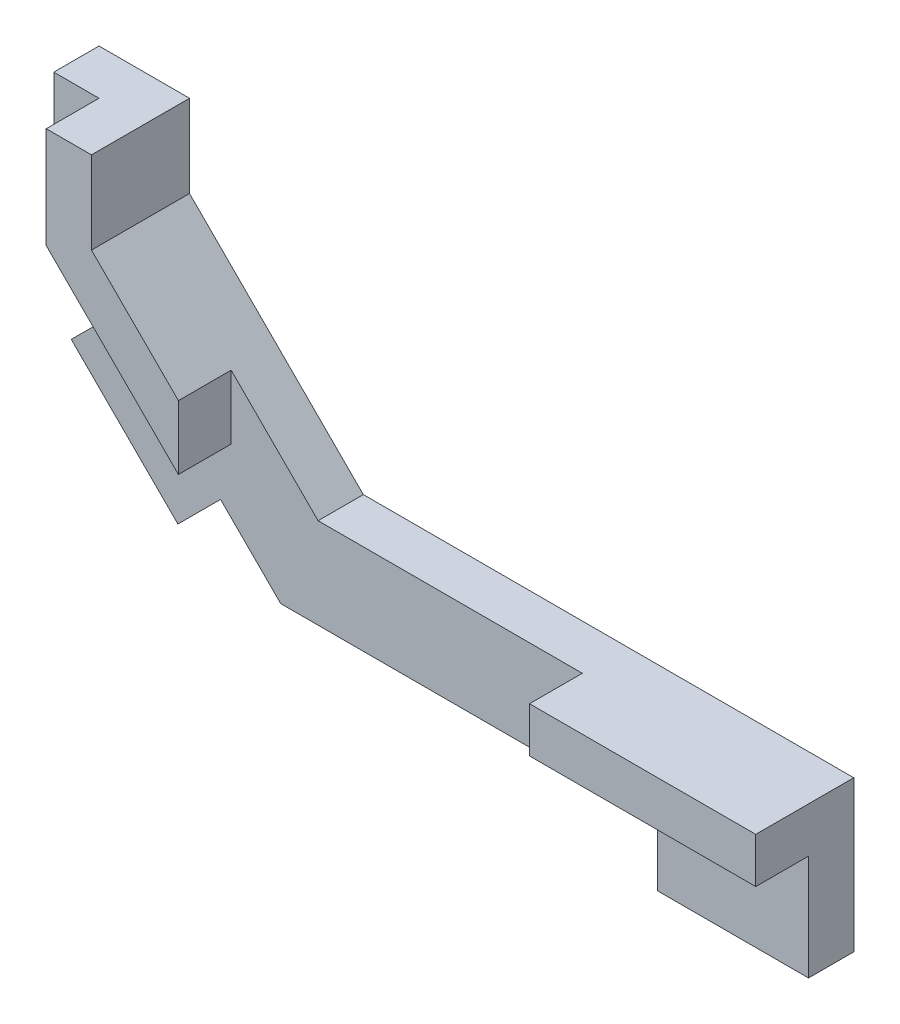
ISO-10303-21;
HEADER;
FILE_DESCRIPTION(('STEP AP214'),'2;1');
FILE_NAME('part.step','',(''),(''),'','','');
FILE_SCHEMA(('AUTOMOTIVE_DESIGN { 1 0 10303 214 1 1 1 1 }'));
ENDSEC;
DATA;
#1=APPLICATION_CONTEXT('core data for automotive mechanical design processes');
#2=APPLICATION_PROTOCOL_DEFINITION('international standard','automotive_design',2000,#1);
#3=PRODUCT_CONTEXT('',#1,'mechanical');
#4=PRODUCT('Part','Part','',(#3));
#5=PRODUCT_RELATED_PRODUCT_CATEGORY('part','',(#4));
#6=PRODUCT_DEFINITION_FORMATION('','',#4);
#7=PRODUCT_DEFINITION_CONTEXT('part definition',#1,'design');
#8=PRODUCT_DEFINITION('design','',#6,#7);
#9=PRODUCT_DEFINITION_SHAPE('','',#8);
#10=(LENGTH_UNIT() NAMED_UNIT(*) SI_UNIT(.MILLI.,.METRE.));
#11=(NAMED_UNIT(*) PLANE_ANGLE_UNIT() SI_UNIT($,.RADIAN.));
#12=(NAMED_UNIT(*) SI_UNIT($,.STERADIAN.) SOLID_ANGLE_UNIT());
#13=UNCERTAINTY_MEASURE_WITH_UNIT(LENGTH_MEASURE(1.E-05),#10,'distance_accuracy_value','');
#14=(GEOMETRIC_REPRESENTATION_CONTEXT(3) GLOBAL_UNCERTAINTY_ASSIGNED_CONTEXT((#13)) GLOBAL_UNIT_ASSIGNED_CONTEXT((#10,
#11,#12)) REPRESENTATION_CONTEXT('',''));
#15=CARTESIAN_POINT('',(0.,0.,0.));
#16=DIRECTION('',(0.,0.,1.));
#17=DIRECTION('',(1.,0.,0.));
#18=AXIS2_PLACEMENT_3D('',#15,#16,#17);
#19=CARTESIAN_POINT('',(-17.5,0.,-30.4149886020059));
#20=DIRECTION('',(-0.707106781186544,-0.707106781186551,0.));
#21=DIRECTION('',(0.707106781186551,-0.707106781186544,0.));
#22=AXIS2_PLACEMENT_3D('',#19,#20,#21);
#23=PLANE('',#22);
#24=DIRECTION('',(0.707106781186551,-0.707106781186544,0.));
#25=VECTOR('',#24,1.);
#26=CARTESIAN_POINT('',(-17.5,0.,1.5));
#27=LINE('',#26,#25);
#28=CARTESIAN_POINT('',(-21.4880822458922,3.9880822458921,1.5));
#29=VERTEX_POINT('',#28);
#30=CARTESIAN_POINT('',(-17.5,0.,1.5));
#31=VERTEX_POINT('',#30);
#32=EDGE_CURVE('E474',#29,#31,#27,.T.);
#33=ORIENTED_EDGE('',*,*,#32,.F.);
#34=DIRECTION('',(0.,0.,1.));
#35=VECTOR('',#34,1.);
#36=CARTESIAN_POINT('',(-21.4880822458922,3.9880822458921,1.5));
#37=LINE('',#36,#35);
#38=CARTESIAN_POINT('',(-21.4880822458922,3.9880822458921,-1.5));
#39=VERTEX_POINT('',#38);
#40=EDGE_CURVE('E536',#39,#29,#37,.T.);
#41=ORIENTED_EDGE('',*,*,#40,.F.);
#42=DIRECTION('',(-0.707106781186551,0.707106781186544,0.));
#43=VECTOR('',#42,1.);
#44=CARTESIAN_POINT('',(-17.5,0.,-1.5));
#45=LINE('',#44,#43);
#46=CARTESIAN_POINT('',(-17.5,0.,-1.5));
#47=VERTEX_POINT('',#46);
#48=EDGE_CURVE('E335',#47,#39,#45,.T.);
#49=ORIENTED_EDGE('',*,*,#48,.F.);
#50=DIRECTION('',(0.,0.,1.));
#51=VECTOR('',#50,1.);
#52=CARTESIAN_POINT('',(-17.5,0.,1.5));
#53=LINE('',#52,#51);
#54=EDGE_CURVE('E464',#47,#31,#53,.T.);
#55=ORIENTED_EDGE('',*,*,#54,.T.);
#56=EDGE_LOOP('',(#33,#41,#49,#55));
#57=FACE_BOUND('',#56,.T.);
#58=ADVANCED_FACE('F165',(#57),#23,.T.);
#59=CARTESIAN_POINT('',(-28.5591500577577,11.0591500577575,-1.5));
#60=VERTEX_POINT('',#59);
#61=CARTESIAN_POINT('',(-32.5472323036498,15.0472323036496,-1.49999999999999));
#62=VERTEX_POINT('',#61);
#63=EDGE_CURVE('E461',#60,#62,#45,.T.);
#64=ORIENTED_EDGE('',*,*,#63,.F.);
#65=DIRECTION('',(0.,0.,-1.));
#66=VECTOR('',#65,1.);
#67=CARTESIAN_POINT('',(-28.5591500577577,11.0591500577575,1.5));
#68=LINE('',#67,#66);
#69=CARTESIAN_POINT('',(-28.5591500577577,11.0591500577575,1.5));
#70=VERTEX_POINT('',#69);
#71=EDGE_CURVE('E330',#70,#60,#68,.T.);
#72=ORIENTED_EDGE('',*,*,#71,.F.);
#73=CARTESIAN_POINT('',(-32.5472323036498,15.0472323036496,1.5));
#74=VERTEX_POINT('',#73);
#75=EDGE_CURVE('E475',#74,#70,#27,.T.);
#76=ORIENTED_EDGE('',*,*,#75,.F.);
#77=DIRECTION('',(0.,0.,1.));
#78=VECTOR('',#77,1.);
#79=CARTESIAN_POINT('',(-32.5472323036498,15.0472323036496,-30.4149886020059));
#80=LINE('',#79,#78);
#81=EDGE_CURVE('E452',#62,#74,#80,.T.);
#82=ORIENTED_EDGE('',*,*,#81,.F.);
#83=EDGE_LOOP('',(#64,#72,#76,#82));
#84=FACE_BOUND('',#83,.T.);
#85=ADVANCED_FACE('F555',(#84),#23,.T.);
#86=CARTESIAN_POINT('',(0.,0.,0.));
#87=DIRECTION('',(0.,1.,0.));
#88=DIRECTION('',(0.,0.,1.));
#89=AXIS2_PLACEMENT_3D('',#86,#87,#88);
#90=PLANE('',#89);
#91=DIRECTION('',(0.,0.,-1.));
#92=VECTOR('',#91,1.);
#93=CARTESIAN_POINT('',(7.49999999999999,0.,-1.5));
#94=LINE('',#93,#92);
#95=CARTESIAN_POINT('',(7.49999999999999,0.,1.5));
#96=VERTEX_POINT('',#95);
#97=CARTESIAN_POINT('',(7.49999999999999,0.,-1.5));
#98=VERTEX_POINT('',#97);
#99=EDGE_CURVE('E189',#96,#98,#94,.T.);
#100=ORIENTED_EDGE('',*,*,#99,.F.);
#101=DIRECTION('',(1.,0.,0.));
#102=VECTOR('',#101,1.);
#103=CARTESIAN_POINT('',(17.5,0.,1.5));
#104=LINE('',#103,#102);
#105=EDGE_CURVE('E508',#31,#96,#104,.T.);
#106=ORIENTED_EDGE('',*,*,#105,.F.);
#107=ORIENTED_EDGE('',*,*,#54,.F.);
#108=DIRECTION('',(-1.,0.,0.));
#109=VECTOR('',#108,1.);
#110=CARTESIAN_POINT('',(17.5,0.,-1.5));
#111=LINE('',#110,#109);
#112=EDGE_CURVE('E499',#98,#47,#111,.T.);
#113=ORIENTED_EDGE('',*,*,#112,.F.);
#114=EDGE_LOOP('',(#100,#106,#107,#113));
#115=FACE_BOUND('',#114,.T.);
#116=ADVANCED_FACE('F533',(#115),#90,.F.);
#117=CARTESIAN_POINT('',(17.5,6.,1.5));
#118=DIRECTION('',(0.,0.,-1.));
#119=DIRECTION('',(-1.,0.,0.));
#120=AXIS2_PLACEMENT_3D('',#117,#118,#119);
#121=PLANE('',#120);
#122=DIRECTION('',(1.,0.,0.));
#123=VECTOR('',#122,1.);
#124=CARTESIAN_POINT('',(17.5,3.,1.5));
#125=LINE('',#124,#123);
#126=CARTESIAN_POINT('',(2.5,3.,1.5));
#127=VERTEX_POINT('',#126);
#128=CARTESIAN_POINT('',(17.5,3.,1.5));
#129=VERTEX_POINT('',#128);
#130=EDGE_CURVE('E395',#127,#129,#125,.T.);
#131=ORIENTED_EDGE('',*,*,#130,.F.);
#132=DIRECTION('',(0.,1.,0.));
#133=VECTOR('',#132,1.);
#134=CARTESIAN_POINT('',(2.5,6.,1.5));
#135=LINE('',#134,#133);
#136=CARTESIAN_POINT('',(2.5,6.,1.5));
#137=VERTEX_POINT('',#136);
#138=EDGE_CURVE('E391',#127,#137,#135,.T.);
#139=ORIENTED_EDGE('',*,*,#138,.T.);
#140=DIRECTION('',(1.,0.,0.));
#141=VECTOR('',#140,1.);
#142=CARTESIAN_POINT('',(17.5,6.,1.5));
#143=LINE('',#142,#141);
#144=CARTESIAN_POINT('',(-15.0200000000001,6.,1.5));
#145=VERTEX_POINT('',#144);
#146=EDGE_CURVE('E494',#145,#137,#143,.T.);
#147=ORIENTED_EDGE('',*,*,#146,.F.);
#148=DIRECTION('',(-0.707106781186551,0.707106781186544,0.));
#149=VECTOR('',#148,1.);
#150=CARTESIAN_POINT('',(-26.5472323036498,17.5272323036496,1.5));
#151=LINE('',#150,#149);
#152=CARTESIAN_POINT('',(-20.783616151825,11.7636161518248,1.5));
#153=VERTEX_POINT('',#152);
#154=EDGE_CURVE('E446',#145,#153,#151,.T.);
#155=ORIENTED_EDGE('',*,*,#154,.T.);
#156=DIRECTION('',(0.,1.,0.));
#157=VECTOR('',#156,1.);
#158=CARTESIAN_POINT('',(-20.7836161518249,6.,1.5));
#159=LINE('',#158,#157);
#160=CARTESIAN_POINT('',(-20.783616151825,7.52097546470556,1.5));
#161=VERTEX_POINT('',#160);
#162=EDGE_CURVE('E426',#161,#153,#159,.T.);
#163=ORIENTED_EDGE('',*,*,#162,.F.);
#164=DIRECTION('',(0.70710678118655,-0.707106781186545,0.));
#165=VECTOR('',#164,1.);
#166=CARTESIAN_POINT('',(-0.881320343559554,-12.3813203435597,1.5));
#167=LINE('',#166,#165);
#168=CARTESIAN_POINT('',(-29.5472323036498,16.2845916165304,1.5));
#169=VERTEX_POINT('',#168);
#170=EDGE_CURVE('E442',#169,#161,#167,.T.);
#171=ORIENTED_EDGE('',*,*,#170,.F.);
#172=DIRECTION('',(0.,-1.,0.));
#173=VECTOR('',#172,1.);
#174=CARTESIAN_POINT('',(-29.5472323036498,6.,1.5));
#175=LINE('',#174,#173);
#176=CARTESIAN_POINT('',(-29.5472323036498,22.9972323036496,1.5));
#177=VERTEX_POINT('',#176);
#178=EDGE_CURVE('E438',#177,#169,#175,.T.);
#179=ORIENTED_EDGE('',*,*,#178,.F.);
#180=DIRECTION('',(-1.,0.,0.));
#181=VECTOR('',#180,1.);
#182=CARTESIAN_POINT('',(-32.5472323036498,22.9972323036496,1.5));
#183=LINE('',#182,#181);
#184=CARTESIAN_POINT('',(-32.5472323036498,22.9972323036496,1.5));
#185=VERTEX_POINT('',#184);
#186=EDGE_CURVE('E467',#177,#185,#183,.T.);
#187=ORIENTED_EDGE('',*,*,#186,.T.);
#188=DIRECTION('',(0.,-1.,0.));
#189=VECTOR('',#188,1.);
#190=CARTESIAN_POINT('',(-32.5472323036498,15.0472323036496,1.5));
#191=LINE('',#190,#189);
#192=EDGE_CURVE('E470',#185,#74,#191,.T.);
#193=ORIENTED_EDGE('',*,*,#192,.T.);
#194=ORIENTED_EDGE('',*,*,#75,.T.);
#195=DIRECTION('',(0.707106781186544,0.707106781186552,0.));
#196=VECTOR('',#195,1.);
#197=CARTESIAN_POINT('',(-31.3875771825039,8.23072293301134,1.5));
#198=LINE('',#197,#196);
#199=CARTESIAN_POINT('',(-31.3875771825039,8.23072293301134,1.5));
#200=VERTEX_POINT('',#199);
#201=EDGE_CURVE('E181',#200,#70,#198,.T.);
#202=ORIENTED_EDGE('',*,*,#201,.F.);
#203=DIRECTION('',(-0.707106781186551,0.707106781186544,0.));
#204=VECTOR('',#203,1.);
#205=CARTESIAN_POINT('',(-24.3165093706383,1.1596551211459,1.5));
#206=LINE('',#205,#204);
#207=CARTESIAN_POINT('',(-24.3165093706383,1.1596551211459,1.5));
#208=VERTEX_POINT('',#207);
#209=EDGE_CURVE('E320',#208,#200,#206,.T.);
#210=ORIENTED_EDGE('',*,*,#209,.F.);
#211=DIRECTION('',(0.707106781186544,0.707106781186552,0.));
#212=VECTOR('',#211,1.);
#213=CARTESIAN_POINT('',(-24.3165093706383,1.1596551211459,1.5));
#214=LINE('',#213,#212);
#215=EDGE_CURVE('E316',#208,#29,#214,.T.);
#216=ORIENTED_EDGE('',*,*,#215,.T.);
#217=ORIENTED_EDGE('',*,*,#32,.T.);
#218=ORIENTED_EDGE('',*,*,#105,.T.);
#219=DIRECTION('',(0.,1.,0.));
#220=VECTOR('',#219,1.);
#221=CARTESIAN_POINT('',(7.49999999999999,-4.,1.5));
#222=LINE('',#221,#220);
#223=CARTESIAN_POINT('',(7.49999999999999,-4.,1.5));
#224=VERTEX_POINT('',#223);
#225=EDGE_CURVE('E362',#224,#96,#222,.T.);
#226=ORIENTED_EDGE('',*,*,#225,.F.);
#227=DIRECTION('',(-1.,0.,0.));
#228=VECTOR('',#227,1.);
#229=CARTESIAN_POINT('',(7.49999999999999,-4.,1.5));
#230=LINE('',#229,#228);
#231=CARTESIAN_POINT('',(17.5,-4.,1.5));
#232=VERTEX_POINT('',#231);
#233=EDGE_CURVE('E348',#232,#224,#230,.T.);
#234=ORIENTED_EDGE('',*,*,#233,.F.);
#235=DIRECTION('',(0.,-1.,0.));
#236=VECTOR('',#235,1.);
#237=CARTESIAN_POINT('',(17.5,6.,1.5));
#238=LINE('',#237,#236);
#239=EDGE_CURVE('E12',#129,#232,#238,.T.);
#240=ORIENTED_EDGE('',*,*,#239,.F.);
#241=EDGE_LOOP('',(#131,#139,#147,#155,#163,#171,#179,#187,#193,#194,#202,#210,#216,#217,#218,
#226,#234,#240));
#242=FACE_BOUND('',#241,.T.);
#243=ADVANCED_FACE('F167',(#242),#121,.F.);
#244=CARTESIAN_POINT('',(17.5,6.,1.5));
#245=DIRECTION('',(-1.,0.,0.));
#246=DIRECTION('',(0.,0.,1.));
#247=AXIS2_PLACEMENT_3D('',#244,#245,#246);
#248=PLANE('',#247);
#249=DIRECTION('',(0.,0.,-1.));
#250=VECTOR('',#249,1.);
#251=CARTESIAN_POINT('',(17.5,6.,1.5));
#252=LINE('',#251,#250);
#253=CARTESIAN_POINT('',(17.5,6.,5.));
#254=VERTEX_POINT('',#253);
#255=CARTESIAN_POINT('',(17.5,6.,-1.5));
#256=VERTEX_POINT('',#255);
#257=EDGE_CURVE('E498',#254,#256,#252,.T.);
#258=ORIENTED_EDGE('',*,*,#257,.F.);
#259=DIRECTION('',(0.,1.,0.));
#260=VECTOR('',#259,1.);
#261=CARTESIAN_POINT('',(17.5,0.,5.));
#262=LINE('',#261,#260);
#263=CARTESIAN_POINT('',(17.5,3.,5.));
#264=VERTEX_POINT('',#263);
#265=EDGE_CURVE('E370',#264,#254,#262,.T.);
#266=ORIENTED_EDGE('',*,*,#265,.F.);
#267=DIRECTION('',(0.,0.,1.));
#268=VECTOR('',#267,1.);
#269=CARTESIAN_POINT('',(17.5,3.,-19.2852605772727));
#270=LINE('',#269,#268);
#271=EDGE_CURVE('E366',#129,#264,#270,.T.);
#272=ORIENTED_EDGE('',*,*,#271,.F.);
#273=ORIENTED_EDGE('',*,*,#239,.T.);
#274=DIRECTION('',(0.,0.,1.));
#275=VECTOR('',#274,1.);
#276=CARTESIAN_POINT('',(17.5,-4.,-1.5));
#277=LINE('',#276,#275);
#278=CARTESIAN_POINT('',(17.5,-4.,-1.5));
#279=VERTEX_POINT('',#278);
#280=EDGE_CURVE('E340',#279,#232,#277,.T.);
#281=ORIENTED_EDGE('',*,*,#280,.F.);
#282=DIRECTION('',(0.,-1.,0.));
#283=VECTOR('',#282,1.);
#284=CARTESIAN_POINT('',(17.5,6.,-1.5));
#285=LINE('',#284,#283);
#286=EDGE_CURVE('E174',#256,#279,#285,.T.);
#287=ORIENTED_EDGE('',*,*,#286,.F.);
#288=EDGE_LOOP('',(#258,#266,#272,#273,#281,#287));
#289=FACE_BOUND('',#288,.T.);
#290=ADVANCED_FACE('F522',(#289),#248,.F.);
#291=CARTESIAN_POINT('',(17.5,6.,-1.5));
#292=DIRECTION('',(0.,0.,1.));
#293=DIRECTION('',(1.,0.,0.));
#294=AXIS2_PLACEMENT_3D('',#291,#292,#293);
#295=PLANE('',#294);
#296=ORIENTED_EDGE('',*,*,#286,.T.);
#297=DIRECTION('',(1.,0.,0.));
#298=VECTOR('',#297,1.);
#299=CARTESIAN_POINT('',(7.49999999999999,-4.,-1.5));
#300=LINE('',#299,#298);
#301=CARTESIAN_POINT('',(7.49999999999999,-4.,-1.5));
#302=VERTEX_POINT('',#301);
#303=EDGE_CURVE('E354',#302,#279,#300,.T.);
#304=ORIENTED_EDGE('',*,*,#303,.F.);
#305=DIRECTION('',(0.,1.,0.));
#306=VECTOR('',#305,1.);
#307=CARTESIAN_POINT('',(7.49999999999999,-4.,-1.5));
#308=LINE('',#307,#306);
#309=EDGE_CURVE('E357',#302,#98,#308,.T.);
#310=ORIENTED_EDGE('',*,*,#309,.T.);
#311=ORIENTED_EDGE('',*,*,#112,.T.);
#312=ORIENTED_EDGE('',*,*,#48,.T.);
#313=DIRECTION('',(0.707106781186544,0.707106781186552,0.));
#314=VECTOR('',#313,1.);
#315=CARTESIAN_POINT('',(-24.3165093706383,1.1596551211459,-1.5));
#316=LINE('',#315,#314);
#317=CARTESIAN_POINT('',(-24.3165093706383,1.1596551211459,-1.5));
#318=VERTEX_POINT('',#317);
#319=EDGE_CURVE('E313',#318,#39,#316,.T.);
#320=ORIENTED_EDGE('',*,*,#319,.F.);
#321=DIRECTION('',(0.707106781186551,-0.707106781186544,0.));
#322=VECTOR('',#321,1.);
#323=CARTESIAN_POINT('',(-24.3165093706383,1.1596551211459,-1.5));
#324=LINE('',#323,#322);
#325=CARTESIAN_POINT('',(-31.3875771825039,8.23072293301134,-1.5));
#326=VERTEX_POINT('',#325);
#327=EDGE_CURVE('E321',#326,#318,#324,.T.);
#328=ORIENTED_EDGE('',*,*,#327,.F.);
#329=DIRECTION('',(0.707106781186544,0.707106781186552,0.));
#330=VECTOR('',#329,1.);
#331=CARTESIAN_POINT('',(-31.3875771825039,8.23072293301134,-1.5));
#332=LINE('',#331,#330);
#333=EDGE_CURVE('E544',#326,#60,#332,.T.);
#334=ORIENTED_EDGE('',*,*,#333,.T.);
#335=ORIENTED_EDGE('',*,*,#63,.T.);
#336=DIRECTION('',(0.,1.,0.));
#337=VECTOR('',#336,1.);
#338=CARTESIAN_POINT('',(-32.5472323036498,15.0472323036496,-1.49999999999999));
#339=LINE('',#338,#337);
#340=CARTESIAN_POINT('',(-32.5472323036498,22.9972323036496,-1.49999999999999));
#341=VERTEX_POINT('',#340);
#342=EDGE_CURVE('E458',#62,#341,#339,.T.);
#343=ORIENTED_EDGE('',*,*,#342,.T.);
#344=DIRECTION('',(1.,0.,0.));
#345=VECTOR('',#344,1.);
#346=CARTESIAN_POINT('',(-32.5472323036498,22.9972323036496,-1.49999999999999));
#347=LINE('',#346,#345);
#348=CARTESIAN_POINT('',(-26.5472323036498,22.9972323036496,-1.5));
#349=VERTEX_POINT('',#348);
#350=EDGE_CURVE('E455',#341,#349,#347,.T.);
#351=ORIENTED_EDGE('',*,*,#350,.T.);
#352=DIRECTION('',(0.,-1.,0.));
#353=VECTOR('',#352,1.);
#354=CARTESIAN_POINT('',(-26.5472323036498,22.9972323036496,-1.5));
#355=LINE('',#354,#353);
#356=CARTESIAN_POINT('',(-26.5472323036498,17.5272323036496,-1.5));
#357=VERTEX_POINT('',#356);
#358=EDGE_CURVE('E451',#349,#357,#355,.T.);
#359=ORIENTED_EDGE('',*,*,#358,.T.);
#360=DIRECTION('',(0.707106781186551,-0.707106781186544,0.));
#361=VECTOR('',#360,1.);
#362=CARTESIAN_POINT('',(-26.5472323036498,17.5272323036496,-1.5));
#363=LINE('',#362,#361);
#364=CARTESIAN_POINT('',(-15.0200000000001,6.,-1.5));
#365=VERTEX_POINT('',#364);
#366=EDGE_CURVE('E447',#357,#365,#363,.T.);
#367=ORIENTED_EDGE('',*,*,#366,.T.);
#368=DIRECTION('',(-1.,0.,0.));
#369=VECTOR('',#368,1.);
#370=CARTESIAN_POINT('',(17.5,6.,-1.5));
#371=LINE('',#370,#369);
#372=EDGE_CURVE('E502',#256,#365,#371,.T.);
#373=ORIENTED_EDGE('',*,*,#372,.F.);
#374=EDGE_LOOP('',(#296,#304,#310,#311,#312,#320,#328,#334,#335,#343,#351,#359,#367,#373));
#375=FACE_BOUND('',#374,.T.);
#376=ADVANCED_FACE('F333',(#375),#295,.F.);
#377=CARTESIAN_POINT('',(0.,6.,0.));
#378=DIRECTION('',(0.,1.,0.));
#379=DIRECTION('',(0.,0.,1.));
#380=AXIS2_PLACEMENT_3D('',#377,#378,#379);
#381=PLANE('',#380);
#382=ORIENTED_EDGE('',*,*,#146,.T.);
#383=DIRECTION('',(0.,0.,1.));
#384=VECTOR('',#383,1.);
#385=CARTESIAN_POINT('',(2.5,6.,-19.2852605772727));
#386=LINE('',#385,#384);
#387=CARTESIAN_POINT('',(2.5,6.,5.));
#388=VERTEX_POINT('',#387);
#389=EDGE_CURVE('E367',#137,#388,#386,.T.);
#390=ORIENTED_EDGE('',*,*,#389,.T.);
#391=DIRECTION('',(-1.,0.,0.));
#392=VECTOR('',#391,1.);
#393=CARTESIAN_POINT('',(0.,6.,5.));
#394=LINE('',#393,#392);
#395=EDGE_CURVE('E387',#254,#388,#394,.T.);
#396=ORIENTED_EDGE('',*,*,#395,.F.);
#397=ORIENTED_EDGE('',*,*,#257,.T.);
#398=ORIENTED_EDGE('',*,*,#372,.T.);
#399=DIRECTION('',(0.,0.,1.));
#400=VECTOR('',#399,1.);
#401=CARTESIAN_POINT('',(-15.0200000000001,6.,-30.4149886020059));
#402=LINE('',#401,#400);
#403=EDGE_CURVE('E479',#365,#145,#402,.T.);
#404=ORIENTED_EDGE('',*,*,#403,.T.);
#405=EDGE_LOOP('',(#382,#390,#396,#397,#398,#404));
#406=FACE_BOUND('',#405,.T.);
#407=ADVANCED_FACE('F591',(#406),#381,.T.);
#408=CARTESIAN_POINT('',(-32.5472323036498,15.0472323036496,-30.4149886020059));
#409=DIRECTION('',(-1.,0.,0.));
#410=DIRECTION('',(0.,-1.,0.));
#411=AXIS2_PLACEMENT_3D('',#408,#409,#410);
#412=PLANE('',#411);
#413=ORIENTED_EDGE('',*,*,#342,.F.);
#414=ORIENTED_EDGE('',*,*,#81,.T.);
#415=ORIENTED_EDGE('',*,*,#192,.F.);
#416=DIRECTION('',(0.,0.,1.));
#417=VECTOR('',#416,1.);
#418=CARTESIAN_POINT('',(-32.5472323036498,22.9972323036496,-30.4149886020059));
#419=LINE('',#418,#417);
#420=EDGE_CURVE('E482',#341,#185,#419,.T.);
#421=ORIENTED_EDGE('',*,*,#420,.F.);
#422=EDGE_LOOP('',(#413,#414,#415,#421));
#423=FACE_BOUND('',#422,.T.);
#424=ADVANCED_FACE('F560',(#423),#412,.T.);
#425=CARTESIAN_POINT('',(-32.5472323036498,22.9972323036496,-30.4149886020059));
#426=DIRECTION('',(0.,1.,0.));
#427=DIRECTION('',(-1.,0.,0.));
#428=AXIS2_PLACEMENT_3D('',#425,#426,#427);
#429=PLANE('',#428);
#430=DIRECTION('',(0.,0.,1.));
#431=VECTOR('',#430,1.);
#432=CARTESIAN_POINT('',(-26.5472323036498,22.9972323036496,-30.4149886020059));
#433=LINE('',#432,#431);
#434=CARTESIAN_POINT('',(-26.5472323036498,22.9972323036496,5.));
#435=VERTEX_POINT('',#434);
#436=EDGE_CURVE('E486',#349,#435,#433,.T.);
#437=ORIENTED_EDGE('',*,*,#436,.F.);
#438=ORIENTED_EDGE('',*,*,#350,.F.);
#439=ORIENTED_EDGE('',*,*,#420,.T.);
#440=ORIENTED_EDGE('',*,*,#186,.F.);
#441=DIRECTION('',(0.,0.,1.));
#442=VECTOR('',#441,1.);
#443=CARTESIAN_POINT('',(-29.5472323036498,22.9972323036496,-19.2852605772727));
#444=LINE('',#443,#442);
#445=CARTESIAN_POINT('',(-29.5472323036498,22.9972323036496,5.));
#446=VERTEX_POINT('',#445);
#447=EDGE_CURVE('E430',#177,#446,#444,.T.);
#448=ORIENTED_EDGE('',*,*,#447,.T.);
#449=DIRECTION('',(-1.,0.,0.));
#450=VECTOR('',#449,1.);
#451=CARTESIAN_POINT('',(0.,22.9972323036496,5.));
#452=LINE('',#451,#450);
#453=EDGE_CURVE('E410',#435,#446,#452,.T.);
#454=ORIENTED_EDGE('',*,*,#453,.F.);
#455=EDGE_LOOP('',(#437,#438,#439,#440,#448,#454));
#456=FACE_BOUND('',#455,.T.);
#457=ADVANCED_FACE('F567',(#456),#429,.T.);
#458=CARTESIAN_POINT('',(-26.5472323036498,22.9972323036496,-30.4149886020059));
#459=DIRECTION('',(1.,0.,0.));
#460=DIRECTION('',(0.,0.,-1.));
#461=AXIS2_PLACEMENT_3D('',#458,#459,#460);
#462=PLANE('',#461);
#463=ORIENTED_EDGE('',*,*,#358,.F.);
#464=ORIENTED_EDGE('',*,*,#436,.T.);
#465=DIRECTION('',(0.,1.,0.));
#466=VECTOR('',#465,1.);
#467=CARTESIAN_POINT('',(-26.5472323036498,0.,5.));
#468=LINE('',#467,#466);
#469=CARTESIAN_POINT('',(-26.5472323036498,17.5272323036496,5.));
#470=VERTEX_POINT('',#469);
#471=EDGE_CURVE('E406',#470,#435,#468,.T.);
#472=ORIENTED_EDGE('',*,*,#471,.F.);
#473=DIRECTION('',(0.,0.,1.));
#474=VECTOR('',#473,1.);
#475=CARTESIAN_POINT('',(-26.5472323036498,17.5272323036496,-30.4149886020059));
#476=LINE('',#475,#474);
#477=EDGE_CURVE('E489',#357,#470,#476,.T.);
#478=ORIENTED_EDGE('',*,*,#477,.F.);
#479=EDGE_LOOP('',(#463,#464,#472,#478));
#480=FACE_BOUND('',#479,.T.);
#481=ADVANCED_FACE('F573',(#480),#462,.T.);
#482=CARTESIAN_POINT('',(-26.5472323036498,17.5272323036496,-30.4149886020059));
#483=DIRECTION('',(0.707106781186543,0.707106781186551,0.));
#484=DIRECTION('',(-0.707106781186551,0.707106781186544,0.));
#485=AXIS2_PLACEMENT_3D('',#482,#483,#484);
#486=PLANE('',#485);
#487=ORIENTED_EDGE('',*,*,#477,.T.);
#488=DIRECTION('',(-0.707106781186551,0.707106781186544,0.));
#489=VECTOR('',#488,1.);
#490=CARTESIAN_POINT('',(-4.50999999999995,-4.51,5.));
#491=LINE('',#490,#489);
#492=CARTESIAN_POINT('',(-20.7836161518249,11.7636161518248,5.));
#493=VERTEX_POINT('',#492);
#494=EDGE_CURVE('E402',#493,#470,#491,.T.);
#495=ORIENTED_EDGE('',*,*,#494,.F.);
#496=DIRECTION('',(0.,0.,1.));
#497=VECTOR('',#496,1.);
#498=CARTESIAN_POINT('',(-20.7836161518249,11.7636161518248,-19.2852605772727));
#499=LINE('',#498,#497);
#500=EDGE_CURVE('E422',#153,#493,#499,.T.);
#501=ORIENTED_EDGE('',*,*,#500,.F.);
#502=ORIENTED_EDGE('',*,*,#154,.F.);
#503=ORIENTED_EDGE('',*,*,#403,.F.);
#504=ORIENTED_EDGE('',*,*,#366,.F.);
#505=EDGE_LOOP('',(#487,#495,#501,#502,#503,#504));
#506=FACE_BOUND('',#505,.T.);
#507=ADVANCED_FACE('F577',(#506),#486,.T.);
#508=CARTESIAN_POINT('',(-6.63132034355962,-6.63132034355967,-19.2852605772727));
#509=DIRECTION('',(0.707106781186545,0.70710678118655,0.));
#510=DIRECTION('',(-0.70710678118655,0.707106781186545,0.));
#511=AXIS2_PLACEMENT_3D('',#508,#509,#510);
#512=PLANE('',#511);
#513=DIRECTION('',(0.,0.,1.));
#514=VECTOR('',#513,1.);
#515=CARTESIAN_POINT('',(-29.5472323036498,16.2845916165304,-19.2852605772727));
#516=LINE('',#515,#514);
#517=CARTESIAN_POINT('',(-29.5472323036498,16.2845916165304,5.));
#518=VERTEX_POINT('',#517);
#519=EDGE_CURVE('E427',#169,#518,#516,.T.);
#520=ORIENTED_EDGE('',*,*,#519,.F.);
#521=ORIENTED_EDGE('',*,*,#170,.T.);
#522=DIRECTION('',(0.,0.,1.));
#523=VECTOR('',#522,1.);
#524=CARTESIAN_POINT('',(-20.7836161518249,7.52097546470556,-19.2852605772727));
#525=LINE('',#524,#523);
#526=CARTESIAN_POINT('',(-20.7836161518249,7.52097546470556,5.));
#527=VERTEX_POINT('',#526);
#528=EDGE_CURVE('E423',#161,#527,#525,.T.);
#529=ORIENTED_EDGE('',*,*,#528,.T.);
#530=DIRECTION('',(-0.70710678118655,0.707106781186545,0.));
#531=VECTOR('',#530,1.);
#532=CARTESIAN_POINT('',(-6.63132034355962,-6.63132034355967,5.));
#533=LINE('',#532,#531);
#534=EDGE_CURVE('E418',#527,#518,#533,.T.);
#535=ORIENTED_EDGE('',*,*,#534,.T.);
#536=EDGE_LOOP('',(#520,#521,#529,#535));
#537=FACE_BOUND('',#536,.T.);
#538=ADVANCED_FACE('F628',(#537),#512,.F.);
#539=CARTESIAN_POINT('',(-29.5472323036498,0.,-19.2852605772727));
#540=DIRECTION('',(1.,0.,0.));
#541=DIRECTION('',(0.,0.,-1.));
#542=AXIS2_PLACEMENT_3D('',#539,#540,#541);
#543=PLANE('',#542);
#544=ORIENTED_EDGE('',*,*,#447,.F.);
#545=ORIENTED_EDGE('',*,*,#178,.T.);
#546=ORIENTED_EDGE('',*,*,#519,.T.);
#547=DIRECTION('',(0.,1.,0.));
#548=VECTOR('',#547,1.);
#549=CARTESIAN_POINT('',(-29.5472323036498,0.,5.));
#550=LINE('',#549,#548);
#551=EDGE_CURVE('E414',#518,#446,#550,.T.);
#552=ORIENTED_EDGE('',*,*,#551,.T.);
#553=EDGE_LOOP('',(#544,#545,#546,#552));
#554=FACE_BOUND('',#553,.T.);
#555=ADVANCED_FACE('F726',(#554),#543,.F.);
#556=CARTESIAN_POINT('',(-20.7836161518249,0.,-19.2852605772727));
#557=DIRECTION('',(-1.,0.,0.));
#558=DIRECTION('',(0.,0.,1.));
#559=AXIS2_PLACEMENT_3D('',#556,#557,#558);
#560=PLANE('',#559);
#561=ORIENTED_EDGE('',*,*,#528,.F.);
#562=ORIENTED_EDGE('',*,*,#162,.T.);
#563=ORIENTED_EDGE('',*,*,#500,.T.);
#564=DIRECTION('',(0.,-1.,0.));
#565=VECTOR('',#564,1.);
#566=CARTESIAN_POINT('',(-20.7836161518249,0.,5.));
#567=LINE('',#566,#565);
#568=EDGE_CURVE('E398',#493,#527,#567,.T.);
#569=ORIENTED_EDGE('',*,*,#568,.T.);
#570=EDGE_LOOP('',(#561,#562,#563,#569));
#571=FACE_BOUND('',#570,.T.);
#572=ADVANCED_FACE('F587',(#571),#560,.F.);
#573=CARTESIAN_POINT('',(0.,0.,5.));
#574=DIRECTION('',(0.,0.,1.));
#575=DIRECTION('',(1.,0.,0.));
#576=AXIS2_PLACEMENT_3D('',#573,#574,#575);
#577=PLANE('',#576);
#578=ORIENTED_EDGE('',*,*,#568,.F.);
#579=ORIENTED_EDGE('',*,*,#494,.T.);
#580=ORIENTED_EDGE('',*,*,#471,.T.);
#581=ORIENTED_EDGE('',*,*,#453,.T.);
#582=ORIENTED_EDGE('',*,*,#551,.F.);
#583=ORIENTED_EDGE('',*,*,#534,.F.);
#584=EDGE_LOOP('',(#578,#579,#580,#581,#582,#583));
#585=FACE_BOUND('',#584,.T.);
#586=ADVANCED_FACE('F582',(#585),#577,.T.);
#587=CARTESIAN_POINT('',(0.,3.,-19.2852605772727));
#588=DIRECTION('',(0.,1.,0.));
#589=DIRECTION('',(-1.,0.,0.));
#590=AXIS2_PLACEMENT_3D('',#587,#588,#589);
#591=PLANE('',#590);
#592=DIRECTION('',(0.,0.,1.));
#593=VECTOR('',#592,1.);
#594=CARTESIAN_POINT('',(2.5,3.,-19.2852605772727));
#595=LINE('',#594,#593);
#596=CARTESIAN_POINT('',(2.5,3.,5.));
#597=VERTEX_POINT('',#596);
#598=EDGE_CURVE('E371',#127,#597,#595,.T.);
#599=ORIENTED_EDGE('',*,*,#598,.F.);
#600=ORIENTED_EDGE('',*,*,#130,.T.);
#601=ORIENTED_EDGE('',*,*,#271,.T.);
#602=DIRECTION('',(-1.,0.,0.));
#603=VECTOR('',#602,1.);
#604=CARTESIAN_POINT('',(0.,3.,5.));
#605=LINE('',#604,#603);
#606=EDGE_CURVE('E379',#264,#597,#605,.T.);
#607=ORIENTED_EDGE('',*,*,#606,.T.);
#608=EDGE_LOOP('',(#599,#600,#601,#607));
#609=FACE_BOUND('',#608,.T.);
#610=ADVANCED_FACE('F599',(#609),#591,.F.);
#611=CARTESIAN_POINT('',(2.5,0.,-19.2852605772727));
#612=DIRECTION('',(-1.,0.,0.));
#613=DIRECTION('',(0.,-1.,0.));
#614=AXIS2_PLACEMENT_3D('',#611,#612,#613);
#615=PLANE('',#614);
#616=ORIENTED_EDGE('',*,*,#138,.F.);
#617=ORIENTED_EDGE('',*,*,#598,.T.);
#618=DIRECTION('',(0.,-1.,0.));
#619=VECTOR('',#618,1.);
#620=CARTESIAN_POINT('',(2.5,0.,5.));
#621=LINE('',#620,#619);
#622=EDGE_CURVE('E383',#388,#597,#621,.T.);
#623=ORIENTED_EDGE('',*,*,#622,.F.);
#624=ORIENTED_EDGE('',*,*,#389,.F.);
#625=EDGE_LOOP('',(#616,#617,#623,#624));
#626=FACE_BOUND('',#625,.T.);
#627=ADVANCED_FACE('F601',(#626),#615,.T.);
#628=CARTESIAN_POINT('',(0.,0.,5.));
#629=DIRECTION('',(0.,0.,1.));
#630=DIRECTION('',(1.,0.,0.));
#631=AXIS2_PLACEMENT_3D('',#628,#629,#630);
#632=PLANE('',#631);
#633=ORIENTED_EDGE('',*,*,#395,.T.);
#634=ORIENTED_EDGE('',*,*,#622,.T.);
#635=ORIENTED_EDGE('',*,*,#606,.F.);
#636=ORIENTED_EDGE('',*,*,#265,.T.);
#637=EDGE_LOOP('',(#633,#634,#635,#636));
#638=FACE_BOUND('',#637,.T.);
#639=ADVANCED_FACE('F596',(#638),#632,.T.);
#640=CARTESIAN_POINT('',(7.49999999999999,-4.,-1.5));
#641=DIRECTION('',(1.,0.,0.));
#642=DIRECTION('',(0.,0.,-1.));
#643=AXIS2_PLACEMENT_3D('',#640,#641,#642);
#644=PLANE('',#643);
#645=ORIENTED_EDGE('',*,*,#99,.T.);
#646=ORIENTED_EDGE('',*,*,#309,.F.);
#647=DIRECTION('',(0.,0.,-1.));
#648=VECTOR('',#647,1.);
#649=CARTESIAN_POINT('',(7.49999999999999,-4.,-1.5));
#650=LINE('',#649,#648);
#651=EDGE_CURVE('E351',#224,#302,#650,.T.);
#652=ORIENTED_EDGE('',*,*,#651,.F.);
#653=ORIENTED_EDGE('',*,*,#225,.T.);
#654=EDGE_LOOP('',(#645,#646,#652,#653));
#655=FACE_BOUND('',#654,.T.);
#656=ADVANCED_FACE('F531',(#655),#644,.F.);
#657=CARTESIAN_POINT('',(0.,-4.,0.));
#658=DIRECTION('',(0.,1.,0.));
#659=DIRECTION('',(0.,0.,1.));
#660=AXIS2_PLACEMENT_3D('',#657,#658,#659);
#661=PLANE('',#660);
#662=ORIENTED_EDGE('',*,*,#280,.T.);
#663=ORIENTED_EDGE('',*,*,#233,.T.);
#664=ORIENTED_EDGE('',*,*,#651,.T.);
#665=ORIENTED_EDGE('',*,*,#303,.T.);
#666=EDGE_LOOP('',(#662,#663,#664,#665));
#667=FACE_BOUND('',#666,.T.);
#668=ADVANCED_FACE('F519',(#667),#661,.F.);
#669=CARTESIAN_POINT('',(-24.3165093706383,1.1596551211459,1.5));
#670=DIRECTION('',(-0.707106781186552,0.707106781186544,0.));
#671=DIRECTION('',(-0.707106781186544,-0.707106781186552,0.));
#672=AXIS2_PLACEMENT_3D('',#669,#670,#671);
#673=PLANE('',#672);
#674=ORIENTED_EDGE('',*,*,#40,.T.);
#675=ORIENTED_EDGE('',*,*,#215,.F.);
#676=DIRECTION('',(0.,0.,1.));
#677=VECTOR('',#676,1.);
#678=CARTESIAN_POINT('',(-24.3165093706383,1.1596551211459,1.5));
#679=LINE('',#678,#677);
#680=EDGE_CURVE('E309',#318,#208,#679,.T.);
#681=ORIENTED_EDGE('',*,*,#680,.F.);
#682=ORIENTED_EDGE('',*,*,#319,.T.);
#683=EDGE_LOOP('',(#674,#675,#681,#682));
#684=FACE_BOUND('',#683,.T.);
#685=ADVANCED_FACE('F311',(#684),#673,.F.);
#686=CARTESIAN_POINT('',(-31.3875771825039,8.23072293301134,1.5));
#687=DIRECTION('',(0.707106781186552,-0.707106781186544,0.));
#688=DIRECTION('',(0.707106781186544,0.707106781186552,0.));
#689=AXIS2_PLACEMENT_3D('',#686,#687,#688);
#690=PLANE('',#689);
#691=ORIENTED_EDGE('',*,*,#71,.T.);
#692=ORIENTED_EDGE('',*,*,#333,.F.);
#693=DIRECTION('',(0.,0.,-1.));
#694=VECTOR('',#693,1.);
#695=CARTESIAN_POINT('',(-31.3875771825039,8.23072293301134,1.5));
#696=LINE('',#695,#694);
#697=EDGE_CURVE('E325',#200,#326,#696,.T.);
#698=ORIENTED_EDGE('',*,*,#697,.F.);
#699=ORIENTED_EDGE('',*,*,#201,.T.);
#700=EDGE_LOOP('',(#691,#692,#698,#699));
#701=FACE_BOUND('',#700,.T.);
#702=ADVANCED_FACE('F550',(#701),#690,.F.);
#703=CARTESIAN_POINT('',(-11.5784271247461,-11.5784271247462,0.));
#704=DIRECTION('',(-0.707106781186544,-0.707106781186551,0.));
#705=DIRECTION('',(0.707106781186551,-0.707106781186544,0.));
#706=AXIS2_PLACEMENT_3D('',#703,#704,#705);
#707=PLANE('',#706);
#708=ORIENTED_EDGE('',*,*,#327,.T.);
#709=ORIENTED_EDGE('',*,*,#680,.T.);
#710=ORIENTED_EDGE('',*,*,#209,.T.);
#711=ORIENTED_EDGE('',*,*,#697,.T.);
#712=EDGE_LOOP('',(#708,#709,#710,#711));
#713=FACE_BOUND('',#712,.T.);
#714=ADVANCED_FACE('F324',(#713),#707,.T.);
#715=CLOSED_SHELL('',(#58,#85,#116,#243,#290,#376,#407,#424,#457,#481,#507,#538,#555,#572,#586,
#610,#627,#639,#656,#668,#685,#702,#714));
#716=MANIFOLD_SOLID_BREP('B2',#715);
#717=ADVANCED_BREP_SHAPE_REPRESENTATION('',(#18,#716),#14);
#718=SHAPE_DEFINITION_REPRESENTATION(#9,#717);
ENDSEC;
END-ISO-10303-21;
